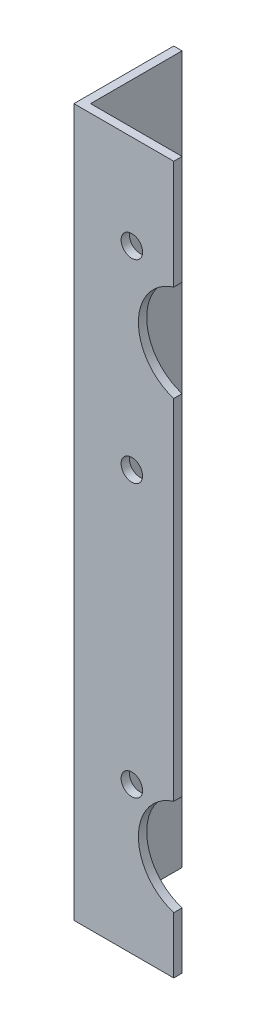
ISO-10303-21;
HEADER;
FILE_DESCRIPTION(('STEP AP214'),'2;1');
FILE_NAME('part.step','',(''),(''),'','','');
FILE_SCHEMA(('AUTOMOTIVE_DESIGN { 1 0 10303 214 1 1 1 1 }'));
ENDSEC;
DATA;
#1=APPLICATION_CONTEXT('core data for automotive mechanical design processes');
#2=APPLICATION_PROTOCOL_DEFINITION('international standard','automotive_design',2000,#1);
#3=PRODUCT_CONTEXT('',#1,'mechanical');
#4=PRODUCT('Part','Part','',(#3));
#5=PRODUCT_RELATED_PRODUCT_CATEGORY('part','',(#4));
#6=PRODUCT_DEFINITION_FORMATION('','',#4);
#7=PRODUCT_DEFINITION_CONTEXT('part definition',#1,'design');
#8=PRODUCT_DEFINITION('design','',#6,#7);
#9=PRODUCT_DEFINITION_SHAPE('','',#8);
#10=(LENGTH_UNIT() NAMED_UNIT(*) SI_UNIT(.MILLI.,.METRE.));
#11=(NAMED_UNIT(*) PLANE_ANGLE_UNIT() SI_UNIT($,.RADIAN.));
#12=(NAMED_UNIT(*) SI_UNIT($,.STERADIAN.) SOLID_ANGLE_UNIT());
#13=UNCERTAINTY_MEASURE_WITH_UNIT(LENGTH_MEASURE(1.E-05),#10,'distance_accuracy_value','');
#14=(GEOMETRIC_REPRESENTATION_CONTEXT(3) GLOBAL_UNCERTAINTY_ASSIGNED_CONTEXT((#13)) GLOBAL_UNIT_ASSIGNED_CONTEXT((#10,
#11,#12)) REPRESENTATION_CONTEXT('',''));
#15=CARTESIAN_POINT('',(0.,0.,0.));
#16=DIRECTION('',(0.,0.,1.));
#17=DIRECTION('',(1.,0.,0.));
#18=AXIS2_PLACEMENT_3D('',#15,#16,#17);
#19=CARTESIAN_POINT('',(19.05,135.,0.));
#20=DIRECTION('',(-1.,0.,0.));
#21=DIRECTION('',(0.,0.,1.));
#22=AXIS2_PLACEMENT_3D('',#19,#20,#21);
#23=PLANE('',#22);
#24=DIRECTION('',(0.,-1.,0.));
#25=VECTOR('',#24,1.);
#26=CARTESIAN_POINT('',(19.05,135.,0.));
#27=LINE('',#26,#25);
#28=CARTESIAN_POINT('',(19.05,95.7960606260145,0.));
#29=VERTEX_POINT('',#28);
#30=CARTESIAN_POINT('',(19.05,29.2039393739855,0.));
#31=VERTEX_POINT('',#30);
#32=EDGE_CURVE('E118',#29,#31,#27,.T.);
#33=ORIENTED_EDGE('',*,*,#32,.T.);
#34=DIRECTION('',(0.,0.,-1.));
#35=VECTOR('',#34,1.);
#36=CARTESIAN_POINT('',(19.05,29.2039393739855,8.4125));
#37=LINE('',#36,#35);
#38=CARTESIAN_POINT('',(19.05,29.2039393739855,-1.5875));
#39=VERTEX_POINT('',#38);
#40=EDGE_CURVE('E108',#31,#39,#37,.T.);
#41=ORIENTED_EDGE('',*,*,#40,.T.);
#42=DIRECTION('',(0.,-1.,0.));
#43=VECTOR('',#42,1.);
#44=CARTESIAN_POINT('',(19.05,135.,-1.5875));
#45=LINE('',#44,#43);
#46=CARTESIAN_POINT('',(19.05,95.7960606260145,-1.5875));
#47=VERTEX_POINT('',#46);
#48=EDGE_CURVE('E116',#47,#39,#45,.T.);
#49=ORIENTED_EDGE('',*,*,#48,.F.);
#50=DIRECTION('',(0.,0.,-1.));
#51=VECTOR('',#50,1.);
#52=CARTESIAN_POINT('',(19.05,95.7960606260145,8.4125));
#53=LINE('',#52,#51);
#54=EDGE_CURVE('E55',#47,#29,#53,.F.);
#55=ORIENTED_EDGE('',*,*,#54,.T.);
#56=EDGE_LOOP('',(#33,#41,#49,#55));
#57=FACE_BOUND('',#56,.T.);
#58=ADVANCED_FACE('F33',(#57),#23,.F.);
#59=CARTESIAN_POINT('',(19.05,135.,0.));
#60=VERTEX_POINT('',#59);
#61=CARTESIAN_POINT('',(19.05,114.203939373985,0.));
#62=VERTEX_POINT('',#61);
#63=EDGE_CURVE('E131',#60,#62,#27,.T.);
#64=ORIENTED_EDGE('',*,*,#63,.T.);
#65=DIRECTION('',(0.,0.,-1.));
#66=VECTOR('',#65,1.);
#67=CARTESIAN_POINT('',(19.05,114.203939373985,8.4125));
#68=LINE('',#67,#66);
#69=CARTESIAN_POINT('',(19.05,114.203939373985,-1.5875));
#70=VERTEX_POINT('',#69);
#71=EDGE_CURVE('E235',#62,#70,#68,.T.);
#72=ORIENTED_EDGE('',*,*,#71,.T.);
#73=CARTESIAN_POINT('',(19.05,135.,-1.5875));
#74=VERTEX_POINT('',#73);
#75=EDGE_CURVE('E123',#74,#70,#45,.T.);
#76=ORIENTED_EDGE('',*,*,#75,.F.);
#77=DIRECTION('',(0.,0.,-1.));
#78=VECTOR('',#77,1.);
#79=CARTESIAN_POINT('',(19.05,135.,0.));
#80=LINE('',#79,#78);
#81=EDGE_CURVE('E194',#60,#74,#80,.T.);
#82=ORIENTED_EDGE('',*,*,#81,.F.);
#83=EDGE_LOOP('',(#64,#72,#76,#82));
#84=FACE_BOUND('',#83,.T.);
#85=ADVANCED_FACE('F212',(#84),#23,.F.);
#86=CARTESIAN_POINT('',(0.,135.,-19.05));
#87=DIRECTION('',(1.,0.,0.));
#88=DIRECTION('',(0.,0.,-1.));
#89=AXIS2_PLACEMENT_3D('',#86,#87,#88);
#90=PLANE('',#89);
#91=CARTESIAN_POINT('',(0.,80.,-11.05));
#92=DIRECTION('',(1.,0.,0.));
#93=DIRECTION('',(0.,0.,-1.));
#94=AXIS2_PLACEMENT_3D('',#91,#92,#93);
#95=CIRCLE('',#94,2.05);
#96=CARTESIAN_POINT('',(0.,80.,-13.1));
#97=VERTEX_POINT('',#96);
#98=EDGE_CURVE('E257',#97,#97,#95,.T.);
#99=ORIENTED_EDGE('',*,*,#98,.T.);
#100=EDGE_LOOP('',(#99));
#101=FACE_BOUND('',#100,.T.);
#102=CARTESIAN_POINT('',(0.,28.,-11.05));
#103=DIRECTION('',(1.,0.,0.));
#104=DIRECTION('',(0.,0.,-1.));
#105=AXIS2_PLACEMENT_3D('',#102,#103,#104);
#106=CIRCLE('',#105,2.05000000000001);
#107=CARTESIAN_POINT('',(0.,28.,-13.1));
#108=VERTEX_POINT('',#107);
#109=EDGE_CURVE('E263',#108,#108,#106,.T.);
#110=ORIENTED_EDGE('',*,*,#109,.T.);
#111=EDGE_LOOP('',(#110));
#112=FACE_BOUND('',#111,.T.);
#113=CARTESIAN_POINT('',(0.,117.,-11.05));
#114=DIRECTION('',(1.,0.,0.));
#115=DIRECTION('',(0.,0.,-1.));
#116=AXIS2_PLACEMENT_3D('',#113,#114,#115);
#117=CIRCLE('',#116,2.05);
#118=CARTESIAN_POINT('',(0.,117.,-13.1));
#119=VERTEX_POINT('',#118);
#120=EDGE_CURVE('E156',#119,#119,#117,.T.);
#121=ORIENTED_EDGE('',*,*,#120,.T.);
#122=EDGE_LOOP('',(#121));
#123=FACE_BOUND('',#122,.T.);
#124=DIRECTION('',(0.,0.,1.));
#125=VECTOR('',#124,1.);
#126=CARTESIAN_POINT('',(0.,0.,-19.05));
#127=LINE('',#126,#125);
#128=CARTESIAN_POINT('',(0.,0.,-19.05));
#129=VERTEX_POINT('',#128);
#130=CARTESIAN_POINT('',(0.,0.,0.));
#131=VERTEX_POINT('',#130);
#132=EDGE_CURVE('E151',#129,#131,#127,.T.);
#133=ORIENTED_EDGE('',*,*,#132,.T.);
#134=DIRECTION('',(0.,-1.,0.));
#135=VECTOR('',#134,1.);
#136=CARTESIAN_POINT('',(0.,135.,0.));
#137=LINE('',#136,#135);
#138=CARTESIAN_POINT('',(0.,135.,0.));
#139=VERTEX_POINT('',#138);
#140=EDGE_CURVE('E134',#139,#131,#137,.T.);
#141=ORIENTED_EDGE('',*,*,#140,.F.);
#142=DIRECTION('',(0.,0.,1.));
#143=VECTOR('',#142,1.);
#144=CARTESIAN_POINT('',(0.,135.,-19.05));
#145=LINE('',#144,#143);
#146=CARTESIAN_POINT('',(0.,135.,-19.05));
#147=VERTEX_POINT('',#146);
#148=EDGE_CURVE('E175',#147,#139,#145,.T.);
#149=ORIENTED_EDGE('',*,*,#148,.F.);
#150=DIRECTION('',(0.,-1.,0.));
#151=VECTOR('',#150,1.);
#152=CARTESIAN_POINT('',(0.,135.,-19.05));
#153=LINE('',#152,#151);
#154=EDGE_CURVE('E153',#147,#129,#153,.T.);
#155=ORIENTED_EDGE('',*,*,#154,.T.);
#156=EDGE_LOOP('',(#133,#141,#149,#155));
#157=FACE_BOUND('',#156,.T.);
#158=ADVANCED_FACE('F35',(#101,#112,#123,#157),#90,.F.);
#159=CARTESIAN_POINT('',(0.,135.,0.));
#160=DIRECTION('',(0.,0.,-1.));
#161=DIRECTION('',(-1.,0.,0.));
#162=AXIS2_PLACEMENT_3D('',#159,#160,#161);
#163=PLANE('',#162);
#164=CARTESIAN_POINT('',(11.05,80.,0.));
#165=DIRECTION('',(0.,0.,-1.));
#166=DIRECTION('',(-1.,0.,0.));
#167=AXIS2_PLACEMENT_3D('',#164,#165,#166);
#168=CIRCLE('',#167,2.05);
#169=CARTESIAN_POINT('',(9.,80.,0.));
#170=VERTEX_POINT('',#169);
#171=EDGE_CURVE('E239',#170,#170,#168,.T.);
#172=ORIENTED_EDGE('',*,*,#171,.T.);
#173=EDGE_LOOP('',(#172));
#174=FACE_BOUND('',#173,.T.);
#175=CARTESIAN_POINT('',(11.05,28.,0.));
#176=DIRECTION('',(0.,0.,-1.));
#177=DIRECTION('',(-1.,0.,0.));
#178=AXIS2_PLACEMENT_3D('',#175,#176,#177);
#179=CIRCLE('',#178,2.05);
#180=CARTESIAN_POINT('',(9.,28.,0.));
#181=VERTEX_POINT('',#180);
#182=EDGE_CURVE('E246',#181,#181,#179,.T.);
#183=ORIENTED_EDGE('',*,*,#182,.T.);
#184=EDGE_LOOP('',(#183));
#185=FACE_BOUND('',#184,.T.);
#186=CARTESIAN_POINT('',(11.05,117.,0.));
#187=DIRECTION('',(0.,0.,-1.));
#188=DIRECTION('',(-1.,0.,0.));
#189=AXIS2_PLACEMENT_3D('',#186,#187,#188);
#190=CIRCLE('',#189,2.05);
#191=CARTESIAN_POINT('',(9.,117.,0.));
#192=VERTEX_POINT('',#191);
#193=EDGE_CURVE('E251',#192,#192,#190,.T.);
#194=ORIENTED_EDGE('',*,*,#193,.T.);
#195=EDGE_LOOP('',(#194));
#196=FACE_BOUND('',#195,.T.);
#197=CARTESIAN_POINT('',(19.05,10.7960606260145,0.));
#198=VERTEX_POINT('',#197);
#199=CARTESIAN_POINT('',(19.05,0.,0.));
#200=VERTEX_POINT('',#199);
#201=EDGE_CURVE('E126',#198,#200,#27,.T.);
#202=ORIENTED_EDGE('',*,*,#201,.F.);
#203=CARTESIAN_POINT('',(21.95,20.,0.));
#204=DIRECTION('',(0.,0.,-1.));
#205=DIRECTION('',(-1.,0.,0.));
#206=AXIS2_PLACEMENT_3D('',#203,#204,#205);
#207=CIRCLE('',#206,9.65);
#208=EDGE_CURVE('E119',#198,#31,#207,.T.);
#209=ORIENTED_EDGE('',*,*,#208,.T.);
#210=ORIENTED_EDGE('',*,*,#32,.F.);
#211=CARTESIAN_POINT('',(21.95,105.,0.));
#212=DIRECTION('',(0.,0.,-1.));
#213=DIRECTION('',(-1.,0.,0.));
#214=AXIS2_PLACEMENT_3D('',#211,#212,#213);
#215=CIRCLE('',#214,9.65000000000001);
#216=EDGE_CURVE('E233',#29,#62,#215,.T.);
#217=ORIENTED_EDGE('',*,*,#216,.T.);
#218=ORIENTED_EDGE('',*,*,#63,.F.);
#219=DIRECTION('',(1.,0.,0.));
#220=VECTOR('',#219,1.);
#221=CARTESIAN_POINT('',(0.,135.,0.));
#222=LINE('',#221,#220);
#223=EDGE_CURVE('E145',#139,#60,#222,.T.);
#224=ORIENTED_EDGE('',*,*,#223,.F.);
#225=ORIENTED_EDGE('',*,*,#140,.T.);
#226=DIRECTION('',(1.,0.,0.));
#227=VECTOR('',#226,1.);
#228=CARTESIAN_POINT('',(0.,0.,0.));
#229=LINE('',#228,#227);
#230=EDGE_CURVE('E142',#131,#200,#229,.T.);
#231=ORIENTED_EDGE('',*,*,#230,.T.);
#232=EDGE_LOOP('',(#202,#209,#210,#217,#218,#224,#225,#231));
#233=FACE_BOUND('',#232,.T.);
#234=ADVANCED_FACE('F141',(#174,#185,#196,#233),#163,.F.);
#235=CARTESIAN_POINT('',(19.05,10.7960606260145,-1.5875));
#236=VERTEX_POINT('',#235);
#237=CARTESIAN_POINT('',(19.05,0.,-1.5875));
#238=VERTEX_POINT('',#237);
#239=EDGE_CURVE('E124',#236,#238,#45,.T.);
#240=ORIENTED_EDGE('',*,*,#239,.F.);
#241=DIRECTION('',(0.,0.,-1.));
#242=VECTOR('',#241,1.);
#243=CARTESIAN_POINT('',(19.05,10.7960606260145,8.4125));
#244=LINE('',#243,#242);
#245=EDGE_CURVE('E48',#236,#198,#244,.F.);
#246=ORIENTED_EDGE('',*,*,#245,.T.);
#247=ORIENTED_EDGE('',*,*,#201,.T.);
#248=DIRECTION('',(0.,0.,-1.));
#249=VECTOR('',#248,1.);
#250=CARTESIAN_POINT('',(19.05,0.,0.));
#251=LINE('',#250,#249);
#252=EDGE_CURVE('E158',#200,#238,#251,.T.);
#253=ORIENTED_EDGE('',*,*,#252,.T.);
#254=EDGE_LOOP('',(#240,#246,#247,#253));
#255=FACE_BOUND('',#254,.T.);
#256=ADVANCED_FACE('F214',(#255),#23,.F.);
#257=CARTESIAN_POINT('',(19.05,135.,-1.5875));
#258=DIRECTION('',(0.,0.,1.));
#259=DIRECTION('',(1.,0.,0.));
#260=AXIS2_PLACEMENT_3D('',#257,#258,#259);
#261=PLANE('',#260);
#262=CARTESIAN_POINT('',(11.05,80.,-1.5875));
#263=DIRECTION('',(0.,0.,-1.));
#264=DIRECTION('',(-1.,0.,0.));
#265=AXIS2_PLACEMENT_3D('',#262,#263,#264);
#266=CIRCLE('',#265,2.05);
#267=CARTESIAN_POINT('',(9.,80.,-1.5875));
#268=VERTEX_POINT('',#267);
#269=EDGE_CURVE('E243',#268,#268,#266,.T.);
#270=ORIENTED_EDGE('',*,*,#269,.F.);
#271=EDGE_LOOP('',(#270));
#272=FACE_BOUND('',#271,.T.);
#273=CARTESIAN_POINT('',(11.05,28.,-1.5875));
#274=DIRECTION('',(0.,0.,-1.));
#275=DIRECTION('',(-1.,0.,0.));
#276=AXIS2_PLACEMENT_3D('',#273,#274,#275);
#277=CIRCLE('',#276,2.05);
#278=CARTESIAN_POINT('',(9.,28.,-1.5875));
#279=VERTEX_POINT('',#278);
#280=EDGE_CURVE('E238',#279,#279,#277,.T.);
#281=ORIENTED_EDGE('',*,*,#280,.F.);
#282=EDGE_LOOP('',(#281));
#283=FACE_BOUND('',#282,.T.);
#284=CARTESIAN_POINT('',(11.05,117.,-1.5875));
#285=DIRECTION('',(0.,0.,-1.));
#286=DIRECTION('',(-1.,0.,0.));
#287=AXIS2_PLACEMENT_3D('',#284,#285,#286);
#288=CIRCLE('',#287,2.05);
#289=CARTESIAN_POINT('',(9.,117.,-1.5875));
#290=VERTEX_POINT('',#289);
#291=EDGE_CURVE('E242',#290,#290,#288,.T.);
#292=ORIENTED_EDGE('',*,*,#291,.F.);
#293=EDGE_LOOP('',(#292));
#294=FACE_BOUND('',#293,.T.);
#295=ORIENTED_EDGE('',*,*,#48,.T.);
#296=CARTESIAN_POINT('',(21.95,20.,-1.5875));
#297=DIRECTION('',(0.,0.,1.));
#298=DIRECTION('',(1.,0.,0.));
#299=AXIS2_PLACEMENT_3D('',#296,#297,#298);
#300=CIRCLE('',#299,9.65);
#301=EDGE_CURVE('E11',#39,#236,#300,.T.);
#302=ORIENTED_EDGE('',*,*,#301,.T.);
#303=ORIENTED_EDGE('',*,*,#239,.T.);
#304=DIRECTION('',(-1.,0.,0.));
#305=VECTOR('',#304,1.);
#306=CARTESIAN_POINT('',(19.05,0.,-1.5875));
#307=LINE('',#306,#305);
#308=CARTESIAN_POINT('',(1.5875,0.,-1.5875));
#309=VERTEX_POINT('',#308);
#310=EDGE_CURVE('E169',#238,#309,#307,.T.);
#311=ORIENTED_EDGE('',*,*,#310,.T.);
#312=DIRECTION('',(0.,-1.,0.));
#313=VECTOR('',#312,1.);
#314=CARTESIAN_POINT('',(1.5875,135.,-1.5875));
#315=LINE('',#314,#313);
#316=CARTESIAN_POINT('',(1.5875,135.,-1.5875));
#317=VERTEX_POINT('',#316);
#318=EDGE_CURVE('E127',#317,#309,#315,.T.);
#319=ORIENTED_EDGE('',*,*,#318,.F.);
#320=DIRECTION('',(-1.,0.,0.));
#321=VECTOR('',#320,1.);
#322=CARTESIAN_POINT('',(19.05,135.,-1.5875));
#323=LINE('',#322,#321);
#324=EDGE_CURVE('E199',#74,#317,#323,.T.);
#325=ORIENTED_EDGE('',*,*,#324,.F.);
#326=ORIENTED_EDGE('',*,*,#75,.T.);
#327=CARTESIAN_POINT('',(21.95,105.,-1.5875));
#328=DIRECTION('',(0.,0.,1.));
#329=DIRECTION('',(1.,0.,0.));
#330=AXIS2_PLACEMENT_3D('',#327,#328,#329);
#331=CIRCLE('',#330,9.65000000000001);
#332=EDGE_CURVE('E41',#70,#47,#331,.T.);
#333=ORIENTED_EDGE('',*,*,#332,.T.);
#334=EDGE_LOOP('',(#295,#302,#303,#311,#319,#325,#326,#333));
#335=FACE_BOUND('',#334,.T.);
#336=ADVANCED_FACE('F121',(#272,#283,#294,#335),#261,.F.);
#337=CARTESIAN_POINT('',(1.5875,135.,-1.5875));
#338=DIRECTION('',(-1.,0.,0.));
#339=DIRECTION('',(0.,0.,1.));
#340=AXIS2_PLACEMENT_3D('',#337,#338,#339);
#341=PLANE('',#340);
#342=CARTESIAN_POINT('',(1.5875,80.,-11.05));
#343=DIRECTION('',(1.,0.,0.));
#344=DIRECTION('',(0.,0.,-1.));
#345=AXIS2_PLACEMENT_3D('',#342,#343,#344);
#346=CIRCLE('',#345,2.05);
#347=CARTESIAN_POINT('',(1.5875,80.,-13.1));
#348=VERTEX_POINT('',#347);
#349=EDGE_CURVE('E260',#348,#348,#346,.T.);
#350=ORIENTED_EDGE('',*,*,#349,.F.);
#351=EDGE_LOOP('',(#350));
#352=FACE_BOUND('',#351,.T.);
#353=CARTESIAN_POINT('',(1.5875,28.,-11.05));
#354=DIRECTION('',(1.,0.,0.));
#355=DIRECTION('',(0.,0.,-1.));
#356=AXIS2_PLACEMENT_3D('',#353,#354,#355);
#357=CIRCLE('',#356,2.05000000000001);
#358=CARTESIAN_POINT('',(1.5875,28.,-13.1));
#359=VERTEX_POINT('',#358);
#360=EDGE_CURVE('E254',#359,#359,#357,.T.);
#361=ORIENTED_EDGE('',*,*,#360,.F.);
#362=EDGE_LOOP('',(#361));
#363=FACE_BOUND('',#362,.T.);
#364=CARTESIAN_POINT('',(1.5875,117.,-11.05));
#365=DIRECTION('',(1.,0.,0.));
#366=DIRECTION('',(0.,0.,-1.));
#367=AXIS2_PLACEMENT_3D('',#364,#365,#366);
#368=CIRCLE('',#367,2.05);
#369=CARTESIAN_POINT('',(1.5875,117.,-13.1));
#370=VERTEX_POINT('',#369);
#371=EDGE_CURVE('E161',#370,#370,#368,.T.);
#372=ORIENTED_EDGE('',*,*,#371,.F.);
#373=EDGE_LOOP('',(#372));
#374=FACE_BOUND('',#373,.T.);
#375=DIRECTION('',(0.,0.,-1.));
#376=VECTOR('',#375,1.);
#377=CARTESIAN_POINT('',(1.5875,0.,-1.5875));
#378=LINE('',#377,#376);
#379=CARTESIAN_POINT('',(1.5875,0.,-19.05));
#380=VERTEX_POINT('',#379);
#381=EDGE_CURVE('E171',#309,#380,#378,.T.);
#382=ORIENTED_EDGE('',*,*,#381,.T.);
#383=DIRECTION('',(0.,-1.,0.));
#384=VECTOR('',#383,1.);
#385=CARTESIAN_POINT('',(1.5875,135.,-19.05));
#386=LINE('',#385,#384);
#387=CARTESIAN_POINT('',(1.5875,135.,-19.05));
#388=VERTEX_POINT('',#387);
#389=EDGE_CURVE('E176',#388,#380,#386,.T.);
#390=ORIENTED_EDGE('',*,*,#389,.F.);
#391=DIRECTION('',(0.,0.,-1.));
#392=VECTOR('',#391,1.);
#393=CARTESIAN_POINT('',(1.5875,135.,-1.5875));
#394=LINE('',#393,#392);
#395=EDGE_CURVE('E187',#317,#388,#394,.T.);
#396=ORIENTED_EDGE('',*,*,#395,.F.);
#397=ORIENTED_EDGE('',*,*,#318,.T.);
#398=EDGE_LOOP('',(#382,#390,#396,#397));
#399=FACE_BOUND('',#398,.T.);
#400=ADVANCED_FACE('F186',(#352,#363,#374,#399),#341,.F.);
#401=CARTESIAN_POINT('',(1.5875,135.,-19.05));
#402=DIRECTION('',(0.,0.,1.));
#403=DIRECTION('',(1.,0.,0.));
#404=AXIS2_PLACEMENT_3D('',#401,#402,#403);
#405=PLANE('',#404);
#406=DIRECTION('',(-1.,0.,0.));
#407=VECTOR('',#406,1.);
#408=CARTESIAN_POINT('',(1.5875,0.,-19.05));
#409=LINE('',#408,#407);
#410=EDGE_CURVE('E173',#380,#129,#409,.T.);
#411=ORIENTED_EDGE('',*,*,#410,.T.);
#412=ORIENTED_EDGE('',*,*,#154,.F.);
#413=DIRECTION('',(-1.,0.,0.));
#414=VECTOR('',#413,1.);
#415=CARTESIAN_POINT('',(1.5875,135.,-19.05));
#416=LINE('',#415,#414);
#417=EDGE_CURVE('E164',#388,#147,#416,.T.);
#418=ORIENTED_EDGE('',*,*,#417,.F.);
#419=ORIENTED_EDGE('',*,*,#389,.T.);
#420=EDGE_LOOP('',(#411,#412,#418,#419));
#421=FACE_BOUND('',#420,.T.);
#422=ADVANCED_FACE('F191',(#421),#405,.F.);
#423=CARTESIAN_POINT('',(0.,135.,0.));
#424=DIRECTION('',(0.,1.,0.));
#425=DIRECTION('',(0.,0.,1.));
#426=AXIS2_PLACEMENT_3D('',#423,#424,#425);
#427=PLANE('',#426);
#428=ORIENTED_EDGE('',*,*,#148,.T.);
#429=ORIENTED_EDGE('',*,*,#223,.T.);
#430=ORIENTED_EDGE('',*,*,#81,.T.);
#431=ORIENTED_EDGE('',*,*,#324,.T.);
#432=ORIENTED_EDGE('',*,*,#395,.T.);
#433=ORIENTED_EDGE('',*,*,#417,.T.);
#434=EDGE_LOOP('',(#428,#429,#430,#431,#432,#433));
#435=FACE_BOUND('',#434,.T.);
#436=ADVANCED_FACE('F200',(#435),#427,.T.);
#437=CARTESIAN_POINT('',(0.,0.,0.));
#438=DIRECTION('',(0.,1.,0.));
#439=DIRECTION('',(0.,0.,1.));
#440=AXIS2_PLACEMENT_3D('',#437,#438,#439);
#441=PLANE('',#440);
#442=ORIENTED_EDGE('',*,*,#132,.F.);
#443=ORIENTED_EDGE('',*,*,#410,.F.);
#444=ORIENTED_EDGE('',*,*,#381,.F.);
#445=ORIENTED_EDGE('',*,*,#310,.F.);
#446=ORIENTED_EDGE('',*,*,#252,.F.);
#447=ORIENTED_EDGE('',*,*,#230,.F.);
#448=EDGE_LOOP('',(#442,#443,#444,#445,#446,#447));
#449=FACE_BOUND('',#448,.T.);
#450=ADVANCED_FACE('F190',(#449),#441,.F.);
#451=CARTESIAN_POINT('',(0.,117.,-11.05));
#452=DIRECTION('',(1.,0.,0.));
#453=DIRECTION('',(0.,0.,-1.));
#454=AXIS2_PLACEMENT_3D('',#451,#452,#453);
#455=CYLINDRICAL_SURFACE('',#454,2.05);
#456=ORIENTED_EDGE('',*,*,#120,.F.);
#457=EDGE_LOOP('',(#456));
#458=FACE_BOUND('',#457,.T.);
#459=ORIENTED_EDGE('',*,*,#371,.T.);
#460=EDGE_LOOP('',(#459));
#461=FACE_BOUND('',#460,.T.);
#462=ADVANCED_FACE('F207',(#458,#461),#455,.F.);
#463=CARTESIAN_POINT('',(0.,28.,-11.05));
#464=DIRECTION('',(1.,0.,0.));
#465=DIRECTION('',(0.,0.,-1.));
#466=AXIS2_PLACEMENT_3D('',#463,#464,#465);
#467=CYLINDRICAL_SURFACE('',#466,2.05000000000001);
#468=ORIENTED_EDGE('',*,*,#109,.F.);
#469=EDGE_LOOP('',(#468));
#470=FACE_BOUND('',#469,.T.);
#471=ORIENTED_EDGE('',*,*,#360,.T.);
#472=EDGE_LOOP('',(#471));
#473=FACE_BOUND('',#472,.T.);
#474=ADVANCED_FACE('F269',(#470,#473),#467,.F.);
#475=CARTESIAN_POINT('',(0.,80.,-11.05));
#476=DIRECTION('',(1.,0.,0.));
#477=DIRECTION('',(0.,0.,-1.));
#478=AXIS2_PLACEMENT_3D('',#475,#476,#477);
#479=CYLINDRICAL_SURFACE('',#478,2.05);
#480=ORIENTED_EDGE('',*,*,#98,.F.);
#481=EDGE_LOOP('',(#480));
#482=FACE_BOUND('',#481,.T.);
#483=ORIENTED_EDGE('',*,*,#349,.T.);
#484=EDGE_LOOP('',(#483));
#485=FACE_BOUND('',#484,.T.);
#486=ADVANCED_FACE('F283',(#482,#485),#479,.F.);
#487=CARTESIAN_POINT('',(11.05,117.,0.));
#488=DIRECTION('',(0.,0.,-1.));
#489=DIRECTION('',(-1.,0.,0.));
#490=AXIS2_PLACEMENT_3D('',#487,#488,#489);
#491=CYLINDRICAL_SURFACE('',#490,2.05);
#492=ORIENTED_EDGE('',*,*,#193,.F.);
#493=EDGE_LOOP('',(#492));
#494=FACE_BOUND('',#493,.T.);
#495=ORIENTED_EDGE('',*,*,#291,.T.);
#496=EDGE_LOOP('',(#495));
#497=FACE_BOUND('',#496,.T.);
#498=ADVANCED_FACE('F290',(#494,#497),#491,.F.);
#499=CARTESIAN_POINT('',(11.05,28.,0.));
#500=DIRECTION('',(0.,0.,-1.));
#501=DIRECTION('',(-1.,0.,0.));
#502=AXIS2_PLACEMENT_3D('',#499,#500,#501);
#503=CYLINDRICAL_SURFACE('',#502,2.05);
#504=ORIENTED_EDGE('',*,*,#182,.F.);
#505=EDGE_LOOP('',(#504));
#506=FACE_BOUND('',#505,.T.);
#507=ORIENTED_EDGE('',*,*,#280,.T.);
#508=EDGE_LOOP('',(#507));
#509=FACE_BOUND('',#508,.T.);
#510=ADVANCED_FACE('F294',(#506,#509),#503,.F.);
#511=CARTESIAN_POINT('',(11.05,80.,0.));
#512=DIRECTION('',(0.,0.,-1.));
#513=DIRECTION('',(-1.,0.,0.));
#514=AXIS2_PLACEMENT_3D('',#511,#512,#513);
#515=CYLINDRICAL_SURFACE('',#514,2.05);
#516=ORIENTED_EDGE('',*,*,#171,.F.);
#517=EDGE_LOOP('',(#516));
#518=FACE_BOUND('',#517,.T.);
#519=ORIENTED_EDGE('',*,*,#269,.T.);
#520=EDGE_LOOP('',(#519));
#521=FACE_BOUND('',#520,.T.);
#522=ADVANCED_FACE('F298',(#518,#521),#515,.F.);
#523=CARTESIAN_POINT('',(21.95,105.,8.4125));
#524=DIRECTION('',(0.,0.,-1.));
#525=DIRECTION('',(-1.,0.,0.));
#526=AXIS2_PLACEMENT_3D('',#523,#524,#525);
#527=CYLINDRICAL_SURFACE('',#526,9.65000000000001);
#528=ORIENTED_EDGE('',*,*,#216,.F.);
#529=ORIENTED_EDGE('',*,*,#54,.F.);
#530=ORIENTED_EDGE('',*,*,#332,.F.);
#531=ORIENTED_EDGE('',*,*,#71,.F.);
#532=EDGE_LOOP('',(#528,#529,#530,#531));
#533=FACE_BOUND('',#532,.T.);
#534=ADVANCED_FACE('F302',(#533),#527,.F.);
#535=CARTESIAN_POINT('',(21.95,20.,8.4125));
#536=DIRECTION('',(0.,0.,-1.));
#537=DIRECTION('',(-1.,0.,0.));
#538=AXIS2_PLACEMENT_3D('',#535,#536,#537);
#539=CYLINDRICAL_SURFACE('',#538,9.65);
#540=ORIENTED_EDGE('',*,*,#208,.F.);
#541=ORIENTED_EDGE('',*,*,#245,.F.);
#542=ORIENTED_EDGE('',*,*,#301,.F.);
#543=ORIENTED_EDGE('',*,*,#40,.F.);
#544=EDGE_LOOP('',(#540,#541,#542,#543));
#545=FACE_BOUND('',#544,.T.);
#546=ADVANCED_FACE('F107',(#545),#539,.F.);
#547=CLOSED_SHELL('',(#58,#85,#158,#234,#256,#336,#400,#422,#436,#450,#462,#474,#486,#498,#510,
#522,#534,#546));
#548=MANIFOLD_SOLID_BREP('B2',#547);
#549=ADVANCED_BREP_SHAPE_REPRESENTATION('',(#18,#548),#14);
#550=SHAPE_DEFINITION_REPRESENTATION(#9,#549);
ENDSEC;
END-ISO-10303-21;
